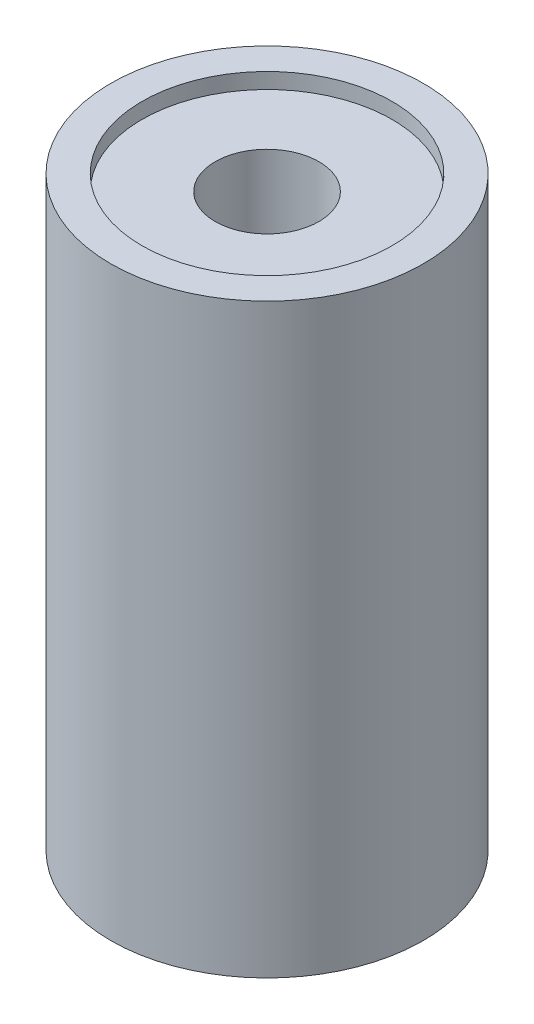
ISO-10303-21;
HEADER;
FILE_DESCRIPTION(('STEP AP214'),'2;1');
FILE_NAME('part.step','',(''),(''),'','','');
FILE_SCHEMA(('AUTOMOTIVE_DESIGN { 1 0 10303 214 1 1 1 1 }'));
ENDSEC;
DATA;
#1=APPLICATION_CONTEXT('core data for automotive mechanical design processes');
#2=APPLICATION_PROTOCOL_DEFINITION('international standard','automotive_design',2000,#1);
#3=PRODUCT_CONTEXT('',#1,'mechanical');
#4=PRODUCT('Part','Part','',(#3));
#5=PRODUCT_RELATED_PRODUCT_CATEGORY('part','',(#4));
#6=PRODUCT_DEFINITION_FORMATION('','',#4);
#7=PRODUCT_DEFINITION_CONTEXT('part definition',#1,'design');
#8=PRODUCT_DEFINITION('design','',#6,#7);
#9=PRODUCT_DEFINITION_SHAPE('','',#8);
#10=(LENGTH_UNIT() NAMED_UNIT(*) SI_UNIT(.MILLI.,.METRE.));
#11=(NAMED_UNIT(*) PLANE_ANGLE_UNIT() SI_UNIT($,.RADIAN.));
#12=(NAMED_UNIT(*) SI_UNIT($,.STERADIAN.) SOLID_ANGLE_UNIT());
#13=UNCERTAINTY_MEASURE_WITH_UNIT(LENGTH_MEASURE(1.E-05),#10,'distance_accuracy_value','');
#14=(GEOMETRIC_REPRESENTATION_CONTEXT(3) GLOBAL_UNCERTAINTY_ASSIGNED_CONTEXT((#13)) GLOBAL_UNIT_ASSIGNED_CONTEXT((#10,
#11,#12)) REPRESENTATION_CONTEXT('',''));
#15=CARTESIAN_POINT('',(0.,0.,0.));
#16=DIRECTION('',(0.,0.,1.));
#17=DIRECTION('',(1.,0.,0.));
#18=AXIS2_PLACEMENT_3D('',#15,#16,#17);
#19=CARTESIAN_POINT('',(0.,-23.8125,0.));
#20=DIRECTION('',(0.,1.,0.));
#21=DIRECTION('',(0.,0.,1.));
#22=AXIS2_PLACEMENT_3D('',#19,#20,#21);
#23=CYLINDRICAL_SURFACE('',#22,12.7);
#24=CARTESIAN_POINT('',(0.,-23.8125,0.));
#25=DIRECTION('',(0.,1.,0.));
#26=DIRECTION('',(0.,0.,1.));
#27=AXIS2_PLACEMENT_3D('',#24,#25,#26);
#28=CIRCLE('',#27,12.7);
#29=CARTESIAN_POINT('',(0.,-23.8125,12.7));
#30=VERTEX_POINT('',#29);
#31=EDGE_CURVE('E11',#30,#30,#28,.T.);
#32=ORIENTED_EDGE('',*,*,#31,.T.);
#33=EDGE_LOOP('',(#32));
#34=FACE_BOUND('',#33,.T.);
#35=CARTESIAN_POINT('',(0.,23.8125,0.));
#36=DIRECTION('',(0.,1.,0.));
#37=DIRECTION('',(0.,0.,1.));
#38=AXIS2_PLACEMENT_3D('',#35,#36,#37);
#39=CIRCLE('',#38,12.7);
#40=CARTESIAN_POINT('',(0.,23.8125,12.7));
#41=VERTEX_POINT('',#40);
#42=EDGE_CURVE('E44',#41,#41,#39,.T.);
#43=ORIENTED_EDGE('',*,*,#42,.F.);
#44=EDGE_LOOP('',(#43));
#45=FACE_BOUND('',#44,.T.);
#46=ADVANCED_FACE('F37',(#34,#45),#23,.T.);
#47=CARTESIAN_POINT('',(0.,-23.8125,0.));
#48=DIRECTION('',(0.,1.,0.));
#49=DIRECTION('',(0.,0.,1.));
#50=AXIS2_PLACEMENT_3D('',#47,#48,#49);
#51=PLANE('',#50);
#52=CARTESIAN_POINT('',(0.,-23.8125,0.));
#53=DIRECTION('',(0.,1.,0.));
#54=DIRECTION('',(0.,0.,1.));
#55=AXIS2_PLACEMENT_3D('',#52,#53,#54);
#56=CIRCLE('',#55,10.16);
#57=CARTESIAN_POINT('',(0.,-23.8125,10.16));
#58=VERTEX_POINT('',#57);
#59=EDGE_CURVE('E60',#58,#58,#56,.T.);
#60=ORIENTED_EDGE('',*,*,#59,.T.);
#61=EDGE_LOOP('',(#60));
#62=FACE_BOUND('',#61,.T.);
#63=ORIENTED_EDGE('',*,*,#31,.F.);
#64=EDGE_LOOP('',(#63));
#65=FACE_BOUND('',#64,.T.);
#66=ADVANCED_FACE('F88',(#62,#65),#51,.F.);
#67=CARTESIAN_POINT('',(0.,23.8125,0.));
#68=DIRECTION('',(0.,1.,0.));
#69=DIRECTION('',(0.,0.,1.));
#70=AXIS2_PLACEMENT_3D('',#67,#68,#69);
#71=PLANE('',#70);
#72=CARTESIAN_POINT('',(0.,23.8125,0.));
#73=DIRECTION('',(0.,1.,0.));
#74=DIRECTION('',(0.,0.,1.));
#75=AXIS2_PLACEMENT_3D('',#72,#73,#74);
#76=CIRCLE('',#75,10.16);
#77=CARTESIAN_POINT('',(0.,23.8125,10.16));
#78=VERTEX_POINT('',#77);
#79=EDGE_CURVE('E77',#78,#78,#76,.T.);
#80=ORIENTED_EDGE('',*,*,#79,.F.);
#81=EDGE_LOOP('',(#80));
#82=FACE_BOUND('',#81,.T.);
#83=ORIENTED_EDGE('',*,*,#42,.T.);
#84=EDGE_LOOP('',(#83));
#85=FACE_BOUND('',#84,.T.);
#86=ADVANCED_FACE('F85',(#82,#85),#71,.T.);
#87=CARTESIAN_POINT('',(0.,22.5425,0.));
#88=DIRECTION('',(0.,1.,0.));
#89=DIRECTION('',(0.,0.,1.));
#90=AXIS2_PLACEMENT_3D('',#87,#88,#89);
#91=CYLINDRICAL_SURFACE('',#90,10.16);
#92=CARTESIAN_POINT('',(0.,22.5425,0.));
#93=DIRECTION('',(0.,1.,0.));
#94=DIRECTION('',(0.,0.,1.));
#95=AXIS2_PLACEMENT_3D('',#92,#93,#94);
#96=CIRCLE('',#95,10.16);
#97=CARTESIAN_POINT('',(0.,22.5425,10.16));
#98=VERTEX_POINT('',#97);
#99=EDGE_CURVE('E78',#98,#98,#96,.T.);
#100=ORIENTED_EDGE('',*,*,#99,.F.);
#101=EDGE_LOOP('',(#100));
#102=FACE_BOUND('',#101,.T.);
#103=ORIENTED_EDGE('',*,*,#79,.T.);
#104=EDGE_LOOP('',(#103));
#105=FACE_BOUND('',#104,.T.);
#106=ADVANCED_FACE('F99',(#102,#105),#91,.F.);
#107=CARTESIAN_POINT('',(0.,22.5425,0.));
#108=DIRECTION('',(0.,1.,0.));
#109=DIRECTION('',(0.,0.,1.));
#110=AXIS2_PLACEMENT_3D('',#107,#108,#109);
#111=PLANE('',#110);
#112=CARTESIAN_POINT('',(0.,22.5425,0.));
#113=DIRECTION('',(0.,1.,0.));
#114=DIRECTION('',(0.,0.,1.));
#115=AXIS2_PLACEMENT_3D('',#112,#113,#114);
#116=CIRCLE('',#115,4.21639999999999);
#117=CARTESIAN_POINT('',(0.,22.5425,4.21639999999999));
#118=VERTEX_POINT('',#117);
#119=EDGE_CURVE('E70',#118,#118,#116,.T.);
#120=ORIENTED_EDGE('',*,*,#119,.F.);
#121=EDGE_LOOP('',(#120));
#122=FACE_BOUND('',#121,.T.);
#123=ORIENTED_EDGE('',*,*,#99,.T.);
#124=EDGE_LOOP('',(#123));
#125=FACE_BOUND('',#124,.T.);
#126=ADVANCED_FACE('F105',(#122,#125),#111,.T.);
#127=CARTESIAN_POINT('',(0.,6.5405,0.));
#128=DIRECTION('',(0.,1.,0.));
#129=DIRECTION('',(0.,0.,1.));
#130=AXIS2_PLACEMENT_3D('',#127,#128,#129);
#131=CONICAL_SURFACE('',#130,4.2164,1.02974425867665);
#132=CARTESIAN_POINT('',(0.,4.0070312859322,0.));
#133=VERTEX_POINT('',#132);
#134=VERTEX_LOOP('',#133);
#135=FACE_BOUND('',#134,.T.);
#136=CARTESIAN_POINT('',(0.,6.5405,0.));
#137=DIRECTION('',(0.,1.,0.));
#138=DIRECTION('',(0.,0.,1.));
#139=AXIS2_PLACEMENT_3D('',#136,#137,#138);
#140=CIRCLE('',#139,4.2164);
#141=CARTESIAN_POINT('',(0.,6.5405,4.2164));
#142=VERTEX_POINT('',#141);
#143=EDGE_CURVE('E74',#142,#142,#140,.T.);
#144=ORIENTED_EDGE('',*,*,#143,.T.);
#145=EDGE_LOOP('',(#144));
#146=FACE_BOUND('',#145,.T.);
#147=ADVANCED_FACE('F109',(#135,#146),#131,.F.);
#148=CARTESIAN_POINT('',(0.,22.5425,0.));
#149=DIRECTION('',(0.,1.,0.));
#150=DIRECTION('',(0.,0.,1.));
#151=AXIS2_PLACEMENT_3D('',#148,#149,#150);
#152=CYLINDRICAL_SURFACE('',#151,4.21639999999999);
#153=ORIENTED_EDGE('',*,*,#143,.F.);
#154=EDGE_LOOP('',(#153));
#155=FACE_BOUND('',#154,.T.);
#156=ORIENTED_EDGE('',*,*,#119,.T.);
#157=EDGE_LOOP('',(#156));
#158=FACE_BOUND('',#157,.T.);
#159=ADVANCED_FACE('F113',(#155,#158),#152,.F.);
#160=CARTESIAN_POINT('',(0.,-22.5425,0.));
#161=DIRECTION('',(0.,-1.,0.));
#162=DIRECTION('',(0.,0.,-1.));
#163=AXIS2_PLACEMENT_3D('',#160,#161,#162);
#164=CYLINDRICAL_SURFACE('',#163,10.16);
#165=CARTESIAN_POINT('',(0.,-22.5425,0.));
#166=DIRECTION('',(0.,1.,0.));
#167=DIRECTION('',(0.,0.,1.));
#168=AXIS2_PLACEMENT_3D('',#165,#166,#167);
#169=CIRCLE('',#168,10.16);
#170=CARTESIAN_POINT('',(0.,-22.5425,10.16));
#171=VERTEX_POINT('',#170);
#172=EDGE_CURVE('E64',#171,#171,#169,.T.);
#173=ORIENTED_EDGE('',*,*,#172,.T.);
#174=EDGE_LOOP('',(#173));
#175=FACE_BOUND('',#174,.T.);
#176=ORIENTED_EDGE('',*,*,#59,.F.);
#177=EDGE_LOOP('',(#176));
#178=FACE_BOUND('',#177,.T.);
#179=ADVANCED_FACE('F116',(#175,#178),#164,.F.);
#180=CARTESIAN_POINT('',(0.,-22.5425,0.));
#181=DIRECTION('',(0.,-1.,0.));
#182=DIRECTION('',(0.,0.,1.));
#183=AXIS2_PLACEMENT_3D('',#180,#181,#182);
#184=PLANE('',#183);
#185=CARTESIAN_POINT('',(0.,-22.5425,0.));
#186=DIRECTION('',(0.,-1.,0.));
#187=DIRECTION('',(0.,0.,-1.));
#188=AXIS2_PLACEMENT_3D('',#185,#186,#187);
#189=CIRCLE('',#188,4.21639999999999);
#190=CARTESIAN_POINT('',(0.,-22.5425,-4.21639999999999));
#191=VERTEX_POINT('',#190);
#192=EDGE_CURVE('E61',#191,#191,#189,.T.);
#193=ORIENTED_EDGE('',*,*,#192,.F.);
#194=EDGE_LOOP('',(#193));
#195=FACE_BOUND('',#194,.T.);
#196=ORIENTED_EDGE('',*,*,#172,.F.);
#197=EDGE_LOOP('',(#196));
#198=FACE_BOUND('',#197,.T.);
#199=ADVANCED_FACE('F54',(#195,#198),#184,.T.);
#200=CARTESIAN_POINT('',(0.,-6.5405,0.));
#201=DIRECTION('',(0.,-1.,0.));
#202=DIRECTION('',(0.,0.,-1.));
#203=AXIS2_PLACEMENT_3D('',#200,#201,#202);
#204=CONICAL_SURFACE('',#203,4.2164,1.02974425867665);
#205=CARTESIAN_POINT('',(0.,-4.0070312859322,0.));
#206=VERTEX_POINT('',#205);
#207=VERTEX_LOOP('',#206);
#208=FACE_BOUND('',#207,.T.);
#209=CARTESIAN_POINT('',(0.,-6.5405,0.));
#210=DIRECTION('',(0.,-1.,0.));
#211=DIRECTION('',(0.,0.,-1.));
#212=AXIS2_PLACEMENT_3D('',#209,#210,#211);
#213=CIRCLE('',#212,4.2164);
#214=CARTESIAN_POINT('',(0.,-6.5405,-4.2164));
#215=VERTEX_POINT('',#214);
#216=EDGE_CURVE('E58',#215,#215,#213,.T.);
#217=ORIENTED_EDGE('',*,*,#216,.T.);
#218=EDGE_LOOP('',(#217));
#219=FACE_BOUND('',#218,.T.);
#220=ADVANCED_FACE('F50',(#208,#219),#204,.F.);
#221=CARTESIAN_POINT('',(0.,-22.5425,0.));
#222=DIRECTION('',(0.,-1.,0.));
#223=DIRECTION('',(0.,0.,-1.));
#224=AXIS2_PLACEMENT_3D('',#221,#222,#223);
#225=CYLINDRICAL_SURFACE('',#224,4.21639999999999);
#226=ORIENTED_EDGE('',*,*,#216,.F.);
#227=EDGE_LOOP('',(#226));
#228=FACE_BOUND('',#227,.T.);
#229=ORIENTED_EDGE('',*,*,#192,.T.);
#230=EDGE_LOOP('',(#229));
#231=FACE_BOUND('',#230,.T.);
#232=ADVANCED_FACE('F53',(#228,#231),#225,.F.);
#233=CLOSED_SHELL('',(#46,#66,#86,#106,#126,#147,#159,#179,#199,#220,#232));
#234=MANIFOLD_SOLID_BREP('B2',#233);
#235=ADVANCED_BREP_SHAPE_REPRESENTATION('',(#18,#234),#14);
#236=SHAPE_DEFINITION_REPRESENTATION(#9,#235);
ENDSEC;
END-ISO-10303-21;
